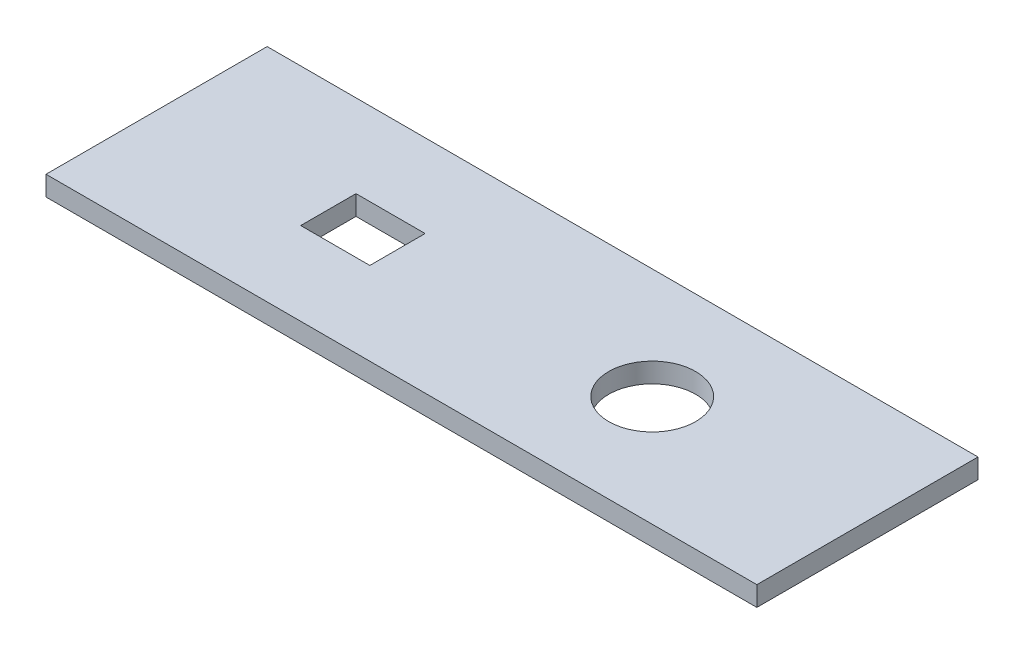
ISO-10303-21;
HEADER;
FILE_DESCRIPTION(('STEP AP214'),'2;1');
FILE_NAME('part.step','',(''),(''),'','','');
FILE_SCHEMA(('AUTOMOTIVE_DESIGN { 1 0 10303 214 1 1 1 1 }'));
ENDSEC;
DATA;
#1=APPLICATION_CONTEXT('core data for automotive mechanical design processes');
#2=APPLICATION_PROTOCOL_DEFINITION('international standard','automotive_design',2000,#1);
#3=PRODUCT_CONTEXT('',#1,'mechanical');
#4=PRODUCT('Part','Part','',(#3));
#5=PRODUCT_RELATED_PRODUCT_CATEGORY('part','',(#4));
#6=PRODUCT_DEFINITION_FORMATION('','',#4);
#7=PRODUCT_DEFINITION_CONTEXT('part definition',#1,'design');
#8=PRODUCT_DEFINITION('design','',#6,#7);
#9=PRODUCT_DEFINITION_SHAPE('','',#8);
#10=(LENGTH_UNIT() NAMED_UNIT(*) SI_UNIT(.MILLI.,.METRE.));
#11=(NAMED_UNIT(*) PLANE_ANGLE_UNIT() SI_UNIT($,.RADIAN.));
#12=(NAMED_UNIT(*) SI_UNIT($,.STERADIAN.) SOLID_ANGLE_UNIT());
#13=UNCERTAINTY_MEASURE_WITH_UNIT(LENGTH_MEASURE(1.E-05),#10,'distance_accuracy_value','');
#14=(GEOMETRIC_REPRESENTATION_CONTEXT(3) GLOBAL_UNCERTAINTY_ASSIGNED_CONTEXT((#13)) GLOBAL_UNIT_ASSIGNED_CONTEXT((#10,
#11,#12)) REPRESENTATION_CONTEXT('',''));
#15=CARTESIAN_POINT('',(0.,0.,0.));
#16=DIRECTION('',(0.,0.,1.));
#17=DIRECTION('',(1.,0.,0.));
#18=AXIS2_PLACEMENT_3D('',#15,#16,#17);
#19=CARTESIAN_POINT('',(0.,5.,0.));
#20=DIRECTION('',(0.,-1.,0.));
#21=DIRECTION('',(0.,0.,-1.));
#22=AXIS2_PLACEMENT_3D('',#19,#20,#21);
#23=PLANE('',#22);
#24=DIRECTION('',(0.,0.,-1.));
#25=VECTOR('',#24,1.);
#26=CARTESIAN_POINT('',(90.,5.,28.));
#27=LINE('',#26,#25);
#28=CARTESIAN_POINT('',(90.,5.,28.));
#29=VERTEX_POINT('',#28);
#30=CARTESIAN_POINT('',(90.,5.,-28.));
#31=VERTEX_POINT('',#30);
#32=EDGE_CURVE('E137',#29,#31,#27,.T.);
#33=ORIENTED_EDGE('',*,*,#32,.T.);
#34=DIRECTION('',(-1.,0.,0.));
#35=VECTOR('',#34,1.);
#36=CARTESIAN_POINT('',(-90.,5.,-28.));
#37=LINE('',#36,#35);
#38=CARTESIAN_POINT('',(-90.,5.,-28.));
#39=VERTEX_POINT('',#38);
#40=EDGE_CURVE('E140',#31,#39,#37,.T.);
#41=ORIENTED_EDGE('',*,*,#40,.T.);
#42=DIRECTION('',(0.,0.,1.));
#43=VECTOR('',#42,1.);
#44=CARTESIAN_POINT('',(-90.,5.,28.));
#45=LINE('',#44,#43);
#46=CARTESIAN_POINT('',(-90.,5.,28.));
#47=VERTEX_POINT('',#46);
#48=EDGE_CURVE('E143',#39,#47,#45,.T.);
#49=ORIENTED_EDGE('',*,*,#48,.T.);
#50=DIRECTION('',(1.,0.,0.));
#51=VECTOR('',#50,1.);
#52=CARTESIAN_POINT('',(-90.,5.,28.));
#53=LINE('',#52,#51);
#54=EDGE_CURVE('E145',#47,#29,#53,.T.);
#55=ORIENTED_EDGE('',*,*,#54,.T.);
#56=EDGE_LOOP('',(#33,#41,#49,#55));
#57=FACE_BOUND('',#56,.T.);
#58=DIRECTION('',(0.,0.,-1.));
#59=VECTOR('',#58,1.);
#60=CARTESIAN_POINT('',(-29.,5.,7.));
#61=LINE('',#60,#59);
#62=CARTESIAN_POINT('',(-29.,5.,7.));
#63=VERTEX_POINT('',#62);
#64=CARTESIAN_POINT('',(-29.,5.,-7.));
#65=VERTEX_POINT('',#64);
#66=EDGE_CURVE('E98',#63,#65,#61,.T.);
#67=ORIENTED_EDGE('',*,*,#66,.F.);
#68=DIRECTION('',(1.,0.,0.));
#69=VECTOR('',#68,1.);
#70=CARTESIAN_POINT('',(-46.5,5.,7.));
#71=LINE('',#70,#69);
#72=CARTESIAN_POINT('',(-46.5,5.,7.));
#73=VERTEX_POINT('',#72);
#74=EDGE_CURVE('E121',#73,#63,#71,.T.);
#75=ORIENTED_EDGE('',*,*,#74,.F.);
#76=DIRECTION('',(0.,0.,1.));
#77=VECTOR('',#76,1.);
#78=CARTESIAN_POINT('',(-46.5,5.,7.));
#79=LINE('',#78,#77);
#80=CARTESIAN_POINT('',(-46.5,5.,-7.));
#81=VERTEX_POINT('',#80);
#82=EDGE_CURVE('E119',#81,#73,#79,.T.);
#83=ORIENTED_EDGE('',*,*,#82,.F.);
#84=DIRECTION('',(-1.,0.,0.));
#85=VECTOR('',#84,1.);
#86=CARTESIAN_POINT('',(-46.5,5.,-7.));
#87=LINE('',#86,#85);
#88=EDGE_CURVE('E106',#65,#81,#87,.T.);
#89=ORIENTED_EDGE('',*,*,#88,.F.);
#90=EDGE_LOOP('',(#67,#75,#83,#89));
#91=FACE_BOUND('',#90,.T.);
#92=CARTESIAN_POINT('',(35.5,5.,0.));
#93=DIRECTION('',(0.,1.,0.));
#94=DIRECTION('',(0.,0.,1.));
#95=AXIS2_PLACEMENT_3D('',#92,#93,#94);
#96=CIRCLE('',#95,11.);
#97=CARTESIAN_POINT('',(35.5,5.,11.));
#98=VERTEX_POINT('',#97);
#99=EDGE_CURVE('E127',#98,#98,#96,.T.);
#100=ORIENTED_EDGE('',*,*,#99,.F.);
#101=EDGE_LOOP('',(#100));
#102=FACE_BOUND('',#101,.T.);
#103=ADVANCED_FACE('F33',(#57,#91,#102),#23,.F.);
#104=CARTESIAN_POINT('',(0.,0.,0.));
#105=DIRECTION('',(0.,-1.,0.));
#106=DIRECTION('',(0.,0.,-1.));
#107=AXIS2_PLACEMENT_3D('',#104,#105,#106);
#108=PLANE('',#107);
#109=DIRECTION('',(1.,0.,0.));
#110=VECTOR('',#109,1.);
#111=CARTESIAN_POINT('',(-46.5,0.,7.));
#112=LINE('',#111,#110);
#113=CARTESIAN_POINT('',(-46.5,0.,7.));
#114=VERTEX_POINT('',#113);
#115=CARTESIAN_POINT('',(-29.,0.,7.));
#116=VERTEX_POINT('',#115);
#117=EDGE_CURVE('E107',#114,#116,#112,.T.);
#118=ORIENTED_EDGE('',*,*,#117,.T.);
#119=DIRECTION('',(0.,0.,-1.));
#120=VECTOR('',#119,1.);
#121=CARTESIAN_POINT('',(-29.,0.,7.));
#122=LINE('',#121,#120);
#123=CARTESIAN_POINT('',(-29.,0.,-7.));
#124=VERTEX_POINT('',#123);
#125=EDGE_CURVE('E56',#116,#124,#122,.T.);
#126=ORIENTED_EDGE('',*,*,#125,.T.);
#127=DIRECTION('',(-1.,0.,0.));
#128=VECTOR('',#127,1.);
#129=CARTESIAN_POINT('',(-46.5,0.,-7.));
#130=LINE('',#129,#128);
#131=CARTESIAN_POINT('',(-46.5,0.,-7.));
#132=VERTEX_POINT('',#131);
#133=EDGE_CURVE('E113',#124,#132,#130,.T.);
#134=ORIENTED_EDGE('',*,*,#133,.T.);
#135=DIRECTION('',(0.,0.,1.));
#136=VECTOR('',#135,1.);
#137=CARTESIAN_POINT('',(-46.5,0.,7.));
#138=LINE('',#137,#136);
#139=EDGE_CURVE('E129',#132,#114,#138,.T.);
#140=ORIENTED_EDGE('',*,*,#139,.T.);
#141=EDGE_LOOP('',(#118,#126,#134,#140));
#142=FACE_BOUND('',#141,.T.);
#143=DIRECTION('',(0.,0.,-1.));
#144=VECTOR('',#143,1.);
#145=CARTESIAN_POINT('',(90.,0.,28.));
#146=LINE('',#145,#144);
#147=CARTESIAN_POINT('',(90.,0.,28.));
#148=VERTEX_POINT('',#147);
#149=CARTESIAN_POINT('',(90.,0.,-28.));
#150=VERTEX_POINT('',#149);
#151=EDGE_CURVE('E114',#148,#150,#146,.T.);
#152=ORIENTED_EDGE('',*,*,#151,.F.);
#153=DIRECTION('',(1.,0.,0.));
#154=VECTOR('',#153,1.);
#155=CARTESIAN_POINT('',(-90.,0.,28.));
#156=LINE('',#155,#154);
#157=CARTESIAN_POINT('',(-90.,0.,28.));
#158=VERTEX_POINT('',#157);
#159=EDGE_CURVE('E141',#158,#148,#156,.T.);
#160=ORIENTED_EDGE('',*,*,#159,.F.);
#161=DIRECTION('',(0.,0.,1.));
#162=VECTOR('',#161,1.);
#163=CARTESIAN_POINT('',(-90.,0.,28.));
#164=LINE('',#163,#162);
#165=CARTESIAN_POINT('',(-90.,0.,-28.));
#166=VERTEX_POINT('',#165);
#167=EDGE_CURVE('E152',#166,#158,#164,.T.);
#168=ORIENTED_EDGE('',*,*,#167,.F.);
#169=DIRECTION('',(-1.,0.,0.));
#170=VECTOR('',#169,1.);
#171=CARTESIAN_POINT('',(-90.,0.,-28.));
#172=LINE('',#171,#170);
#173=EDGE_CURVE('E150',#150,#166,#172,.T.);
#174=ORIENTED_EDGE('',*,*,#173,.F.);
#175=EDGE_LOOP('',(#152,#160,#168,#174));
#176=FACE_BOUND('',#175,.T.);
#177=CARTESIAN_POINT('',(35.5,0.,0.));
#178=DIRECTION('',(0.,1.,0.));
#179=DIRECTION('',(0.,0.,1.));
#180=AXIS2_PLACEMENT_3D('',#177,#178,#179);
#181=CIRCLE('',#180,11.);
#182=CARTESIAN_POINT('',(35.5,0.,11.));
#183=VERTEX_POINT('',#182);
#184=EDGE_CURVE('E224',#183,#183,#181,.T.);
#185=ORIENTED_EDGE('',*,*,#184,.T.);
#186=EDGE_LOOP('',(#185));
#187=FACE_BOUND('',#186,.T.);
#188=ADVANCED_FACE('F170',(#142,#176,#187),#108,.T.);
#189=CARTESIAN_POINT('',(90.,5.,28.));
#190=DIRECTION('',(-1.,0.,0.));
#191=DIRECTION('',(0.,0.,1.));
#192=AXIS2_PLACEMENT_3D('',#189,#190,#191);
#193=PLANE('',#192);
#194=ORIENTED_EDGE('',*,*,#151,.T.);
#195=DIRECTION('',(0.,-1.,0.));
#196=VECTOR('',#195,1.);
#197=CARTESIAN_POINT('',(90.,5.,-28.));
#198=LINE('',#197,#196);
#199=EDGE_CURVE('E11',#31,#150,#198,.T.);
#200=ORIENTED_EDGE('',*,*,#199,.F.);
#201=ORIENTED_EDGE('',*,*,#32,.F.);
#202=DIRECTION('',(0.,-1.,0.));
#203=VECTOR('',#202,1.);
#204=CARTESIAN_POINT('',(90.,5.,28.));
#205=LINE('',#204,#203);
#206=EDGE_CURVE('E147',#29,#148,#205,.T.);
#207=ORIENTED_EDGE('',*,*,#206,.T.);
#208=EDGE_LOOP('',(#194,#200,#201,#207));
#209=FACE_BOUND('',#208,.T.);
#210=ADVANCED_FACE('F35',(#209),#193,.F.);
#211=CARTESIAN_POINT('',(-90.,5.,-28.));
#212=DIRECTION('',(0.,0.,1.));
#213=DIRECTION('',(1.,0.,0.));
#214=AXIS2_PLACEMENT_3D('',#211,#212,#213);
#215=PLANE('',#214);
#216=ORIENTED_EDGE('',*,*,#173,.T.);
#217=DIRECTION('',(0.,-1.,0.));
#218=VECTOR('',#217,1.);
#219=CARTESIAN_POINT('',(-90.,5.,-28.));
#220=LINE('',#219,#218);
#221=EDGE_CURVE('E41',#39,#166,#220,.T.);
#222=ORIENTED_EDGE('',*,*,#221,.F.);
#223=ORIENTED_EDGE('',*,*,#40,.F.);
#224=ORIENTED_EDGE('',*,*,#199,.T.);
#225=EDGE_LOOP('',(#216,#222,#223,#224));
#226=FACE_BOUND('',#225,.T.);
#227=ADVANCED_FACE('F180',(#226),#215,.F.);
#228=CARTESIAN_POINT('',(-90.,5.,28.));
#229=DIRECTION('',(1.,0.,0.));
#230=DIRECTION('',(0.,0.,-1.));
#231=AXIS2_PLACEMENT_3D('',#228,#229,#230);
#232=PLANE('',#231);
#233=ORIENTED_EDGE('',*,*,#167,.T.);
#234=DIRECTION('',(0.,-1.,0.));
#235=VECTOR('',#234,1.);
#236=CARTESIAN_POINT('',(-90.,5.,28.));
#237=LINE('',#236,#235);
#238=EDGE_CURVE('E157',#47,#158,#237,.T.);
#239=ORIENTED_EDGE('',*,*,#238,.F.);
#240=ORIENTED_EDGE('',*,*,#48,.F.);
#241=ORIENTED_EDGE('',*,*,#221,.T.);
#242=EDGE_LOOP('',(#233,#239,#240,#241));
#243=FACE_BOUND('',#242,.T.);
#244=ADVANCED_FACE('F164',(#243),#232,.F.);
#245=CARTESIAN_POINT('',(-90.,5.,28.));
#246=DIRECTION('',(0.,0.,-1.));
#247=DIRECTION('',(-1.,0.,0.));
#248=AXIS2_PLACEMENT_3D('',#245,#246,#247);
#249=PLANE('',#248);
#250=ORIENTED_EDGE('',*,*,#159,.T.);
#251=ORIENTED_EDGE('',*,*,#206,.F.);
#252=ORIENTED_EDGE('',*,*,#54,.F.);
#253=ORIENTED_EDGE('',*,*,#238,.T.);
#254=EDGE_LOOP('',(#250,#251,#252,#253));
#255=FACE_BOUND('',#254,.T.);
#256=ADVANCED_FACE('F174',(#255),#249,.F.);
#257=CARTESIAN_POINT('',(-29.,5.,7.));
#258=DIRECTION('',(-1.,0.,0.));
#259=DIRECTION('',(0.,0.,1.));
#260=AXIS2_PLACEMENT_3D('',#257,#258,#259);
#261=PLANE('',#260);
#262=ORIENTED_EDGE('',*,*,#125,.F.);
#263=DIRECTION('',(0.,-1.,0.));
#264=VECTOR('',#263,1.);
#265=CARTESIAN_POINT('',(-29.,5.,7.));
#266=LINE('',#265,#264);
#267=EDGE_CURVE('E102',#63,#116,#266,.T.);
#268=ORIENTED_EDGE('',*,*,#267,.F.);
#269=ORIENTED_EDGE('',*,*,#66,.T.);
#270=DIRECTION('',(0.,-1.,0.));
#271=VECTOR('',#270,1.);
#272=CARTESIAN_POINT('',(-29.,5.,-7.));
#273=LINE('',#272,#271);
#274=EDGE_CURVE('E101',#65,#124,#273,.T.);
#275=ORIENTED_EDGE('',*,*,#274,.T.);
#276=EDGE_LOOP('',(#262,#268,#269,#275));
#277=FACE_BOUND('',#276,.T.);
#278=ADVANCED_FACE('F100',(#277),#261,.T.);
#279=CARTESIAN_POINT('',(-46.5,5.,-7.));
#280=DIRECTION('',(0.,0.,1.));
#281=DIRECTION('',(1.,0.,0.));
#282=AXIS2_PLACEMENT_3D('',#279,#280,#281);
#283=PLANE('',#282);
#284=ORIENTED_EDGE('',*,*,#133,.F.);
#285=ORIENTED_EDGE('',*,*,#274,.F.);
#286=ORIENTED_EDGE('',*,*,#88,.T.);
#287=DIRECTION('',(0.,-1.,0.));
#288=VECTOR('',#287,1.);
#289=CARTESIAN_POINT('',(-46.5,5.,-7.));
#290=LINE('',#289,#288);
#291=EDGE_CURVE('E115',#81,#132,#290,.T.);
#292=ORIENTED_EDGE('',*,*,#291,.T.);
#293=EDGE_LOOP('',(#284,#285,#286,#292));
#294=FACE_BOUND('',#293,.T.);
#295=ADVANCED_FACE('F110',(#294),#283,.T.);
#296=CARTESIAN_POINT('',(-46.5,5.,7.));
#297=DIRECTION('',(1.,0.,0.));
#298=DIRECTION('',(0.,0.,-1.));
#299=AXIS2_PLACEMENT_3D('',#296,#297,#298);
#300=PLANE('',#299);
#301=ORIENTED_EDGE('',*,*,#139,.F.);
#302=ORIENTED_EDGE('',*,*,#291,.F.);
#303=ORIENTED_EDGE('',*,*,#82,.T.);
#304=DIRECTION('',(0.,-1.,0.));
#305=VECTOR('',#304,1.);
#306=CARTESIAN_POINT('',(-46.5,5.,7.));
#307=LINE('',#306,#305);
#308=EDGE_CURVE('E48',#73,#114,#307,.T.);
#309=ORIENTED_EDGE('',*,*,#308,.T.);
#310=EDGE_LOOP('',(#301,#302,#303,#309));
#311=FACE_BOUND('',#310,.T.);
#312=ADVANCED_FACE('F204',(#311),#300,.T.);
#313=CARTESIAN_POINT('',(-46.5,5.,7.));
#314=DIRECTION('',(0.,0.,-1.));
#315=DIRECTION('',(-1.,0.,0.));
#316=AXIS2_PLACEMENT_3D('',#313,#314,#315);
#317=PLANE('',#316);
#318=ORIENTED_EDGE('',*,*,#117,.F.);
#319=ORIENTED_EDGE('',*,*,#308,.F.);
#320=ORIENTED_EDGE('',*,*,#74,.T.);
#321=ORIENTED_EDGE('',*,*,#267,.T.);
#322=EDGE_LOOP('',(#318,#319,#320,#321));
#323=FACE_BOUND('',#322,.T.);
#324=ADVANCED_FACE('F208',(#323),#317,.T.);
#325=CARTESIAN_POINT('',(35.5,5.,0.));
#326=DIRECTION('',(0.,-1.,0.));
#327=DIRECTION('',(0.,0.,-1.));
#328=AXIS2_PLACEMENT_3D('',#325,#326,#327);
#329=CYLINDRICAL_SURFACE('',#328,11.);
#330=ORIENTED_EDGE('',*,*,#99,.T.);
#331=EDGE_LOOP('',(#330));
#332=FACE_BOUND('',#331,.T.);
#333=ORIENTED_EDGE('',*,*,#184,.F.);
#334=EDGE_LOOP('',(#333));
#335=FACE_BOUND('',#334,.T.);
#336=ADVANCED_FACE('F214',(#332,#335),#329,.F.);
#337=CLOSED_SHELL('',(#103,#188,#210,#227,#244,#256,#278,#295,#312,#324,#336));
#338=MANIFOLD_SOLID_BREP('B2',#337);
#339=ADVANCED_BREP_SHAPE_REPRESENTATION('',(#18,#338),#14);
#340=SHAPE_DEFINITION_REPRESENTATION(#9,#339);
ENDSEC;
END-ISO-10303-21;
